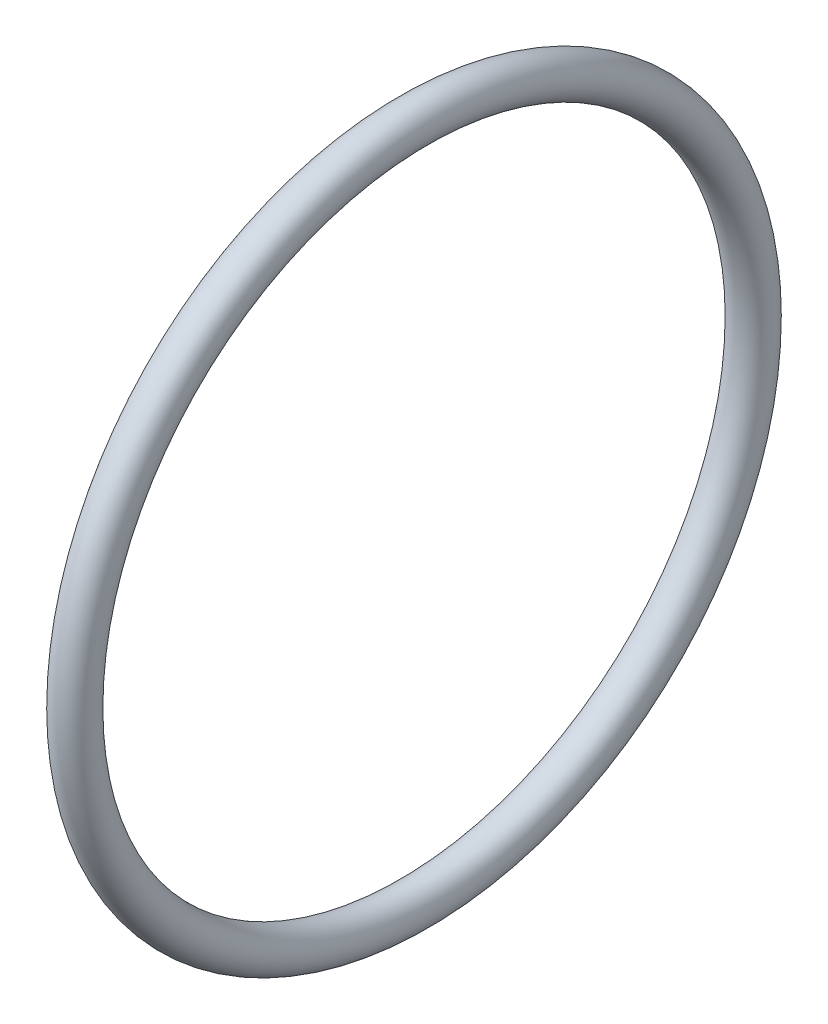
ISO-10303-21;
HEADER;
FILE_DESCRIPTION(('STEP AP214'),'2;1');
FILE_NAME('part.step','',(''),(''),'','','');
FILE_SCHEMA(('AUTOMOTIVE_DESIGN { 1 0 10303 214 1 1 1 1 }'));
ENDSEC;
DATA;
#1=APPLICATION_CONTEXT('core data for automotive mechanical design processes');
#2=APPLICATION_PROTOCOL_DEFINITION('international standard','automotive_design',2000,#1);
#3=PRODUCT_CONTEXT('',#1,'mechanical');
#4=PRODUCT('Part','Part','',(#3));
#5=PRODUCT_RELATED_PRODUCT_CATEGORY('part','',(#4));
#6=PRODUCT_DEFINITION_FORMATION('','',#4);
#7=PRODUCT_DEFINITION_CONTEXT('part definition',#1,'design');
#8=PRODUCT_DEFINITION('design','',#6,#7);
#9=PRODUCT_DEFINITION_SHAPE('','',#8);
#10=(LENGTH_UNIT() NAMED_UNIT(*) SI_UNIT(.MILLI.,.METRE.));
#11=(NAMED_UNIT(*) PLANE_ANGLE_UNIT() SI_UNIT($,.RADIAN.));
#12=(NAMED_UNIT(*) SI_UNIT($,.STERADIAN.) SOLID_ANGLE_UNIT());
#13=UNCERTAINTY_MEASURE_WITH_UNIT(LENGTH_MEASURE(1.E-05),#10,'distance_accuracy_value','');
#14=(GEOMETRIC_REPRESENTATION_CONTEXT(3) GLOBAL_UNCERTAINTY_ASSIGNED_CONTEXT((#13)) GLOBAL_UNIT_ASSIGNED_CONTEXT((#10,
#11,#12)) REPRESENTATION_CONTEXT('',''));
#15=CARTESIAN_POINT('',(0.,0.,0.));
#16=DIRECTION('',(0.,0.,1.));
#17=DIRECTION('',(1.,0.,0.));
#18=AXIS2_PLACEMENT_3D('',#15,#16,#17);
#19=CARTESIAN_POINT('',(0.,0.,0.));
#20=DIRECTION('',(-1.,0.,0.));
#21=DIRECTION('',(0.,0.,1.));
#22=AXIS2_PLACEMENT_3D('',#19,#20,#21);
#23=TOROIDAL_SURFACE('',#22,30.135,1.765);
#24=CARTESIAN_POINT('',(0.,0.,31.9));
#25=VERTEX_POINT('',#24);
#26=VERTEX_LOOP('',#25);
#27=FACE_BOUND('',#26,.T.);
#28=ADVANCED_FACE('F30',(#27),#23,.T.);
#29=CLOSED_SHELL('',(#28));
#30=MANIFOLD_SOLID_BREP('B2',#29);
#31=ADVANCED_BREP_SHAPE_REPRESENTATION('',(#18,#30),#14);
#32=SHAPE_DEFINITION_REPRESENTATION(#9,#31);
ENDSEC;
END-ISO-10303-21;
